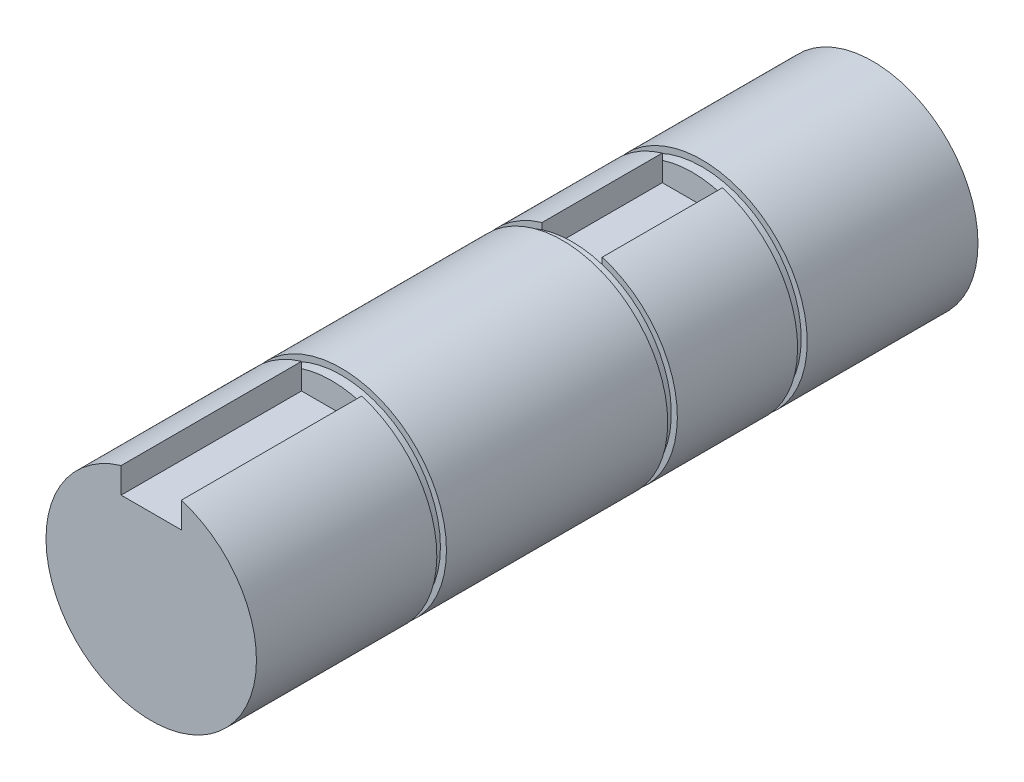
ISO-10303-21;
HEADER;
FILE_DESCRIPTION(('STEP AP214'),'2;1');
FILE_NAME('part.step','',(''),(''),'','','');
FILE_SCHEMA(('AUTOMOTIVE_DESIGN { 1 0 10303 214 1 1 1 1 }'));
ENDSEC;
DATA;
#1=APPLICATION_CONTEXT('core data for automotive mechanical design processes');
#2=APPLICATION_PROTOCOL_DEFINITION('international standard','automotive_design',2000,#1);
#3=PRODUCT_CONTEXT('',#1,'mechanical');
#4=PRODUCT('Part','Part','',(#3));
#5=PRODUCT_RELATED_PRODUCT_CATEGORY('part','',(#4));
#6=PRODUCT_DEFINITION_FORMATION('','',#4);
#7=PRODUCT_DEFINITION_CONTEXT('part definition',#1,'design');
#8=PRODUCT_DEFINITION('design','',#6,#7);
#9=PRODUCT_DEFINITION_SHAPE('','',#8);
#10=(LENGTH_UNIT() NAMED_UNIT(*) SI_UNIT(.MILLI.,.METRE.));
#11=(NAMED_UNIT(*) PLANE_ANGLE_UNIT() SI_UNIT($,.RADIAN.));
#12=(NAMED_UNIT(*) SI_UNIT($,.STERADIAN.) SOLID_ANGLE_UNIT());
#13=UNCERTAINTY_MEASURE_WITH_UNIT(LENGTH_MEASURE(1.E-05),#10,'distance_accuracy_value','');
#14=(GEOMETRIC_REPRESENTATION_CONTEXT(3) GLOBAL_UNCERTAINTY_ASSIGNED_CONTEXT((#13)) GLOBAL_UNIT_ASSIGNED_CONTEXT((#10,
#11,#12)) REPRESENTATION_CONTEXT('',''));
#15=CARTESIAN_POINT('',(0.,0.,0.));
#16=DIRECTION('',(0.,0.,1.));
#17=DIRECTION('',(1.,0.,0.));
#18=AXIS2_PLACEMENT_3D('',#15,#16,#17);
#19=CARTESIAN_POINT('',(0.,0.,120.));
#20=DIRECTION('',(0.,0.,-1.));
#21=DIRECTION('',(-1.,0.,0.));
#22=AXIS2_PLACEMENT_3D('',#19,#20,#21);
#23=CYLINDRICAL_SURFACE('',#22,17.5);
#24=CARTESIAN_POINT('',(0.,0.,28.4));
#25=DIRECTION('',(0.,0.,-1.));
#26=DIRECTION('',(-1.,0.,0.));
#27=AXIS2_PLACEMENT_3D('',#24,#25,#26);
#28=CIRCLE('',#27,17.5);
#29=CARTESIAN_POINT('',(-17.5,0.,28.4));
#30=VERTEX_POINT('',#29);
#31=EDGE_CURVE('E267',#30,#30,#28,.T.);
#32=ORIENTED_EDGE('',*,*,#31,.T.);
#33=EDGE_LOOP('',(#32));
#34=FACE_BOUND('',#33,.T.);
#35=CARTESIAN_POINT('',(0.,0.,0.));
#36=DIRECTION('',(0.,0.,1.));
#37=DIRECTION('',(1.,0.,0.));
#38=AXIS2_PLACEMENT_3D('',#35,#36,#37);
#39=CIRCLE('',#38,17.5);
#40=CARTESIAN_POINT('',(17.5,0.,0.));
#41=VERTEX_POINT('',#40);
#42=EDGE_CURVE('E36',#41,#41,#39,.T.);
#43=ORIENTED_EDGE('',*,*,#42,.T.);
#44=EDGE_LOOP('',(#43));
#45=FACE_BOUND('',#44,.T.);
#46=ADVANCED_FACE('F33',(#34,#45),#23,.T.);
#47=CARTESIAN_POINT('',(0.,0.,0.));
#48=DIRECTION('',(0.,0.,1.));
#49=DIRECTION('',(1.,0.,0.));
#50=AXIS2_PLACEMENT_3D('',#47,#48,#49);
#51=PLANE('',#50);
#52=ORIENTED_EDGE('',*,*,#42,.F.);
#53=EDGE_LOOP('',(#52));
#54=FACE_BOUND('',#53,.T.);
#55=ADVANCED_FACE('F183',(#54),#51,.F.);
#56=CARTESIAN_POINT('',(0.,17.5,30.));
#57=DIRECTION('',(0.,0.,1.));
#58=DIRECTION('',(1.,0.,0.));
#59=AXIS2_PLACEMENT_3D('',#56,#57,#58);
#60=PLANE('',#59);
#61=DIRECTION('',(0.,-1.,0.));
#62=VECTOR('',#61,1.);
#63=CARTESIAN_POINT('',(-5.00000000000001,16.7705098312484,30.));
#64=LINE('',#63,#62);
#65=CARTESIAN_POINT('',(-5.00000000000001,16.7705098312484,30.));
#66=VERTEX_POINT('',#65);
#67=CARTESIAN_POINT('',(-5.00000000000001,15.7241851935164,30.));
#68=VERTEX_POINT('',#67);
#69=EDGE_CURVE('E142',#66,#68,#64,.T.);
#70=ORIENTED_EDGE('',*,*,#69,.T.);
#71=CARTESIAN_POINT('',(0.,0.,30.));
#72=DIRECTION('',(0.,0.,-1.));
#73=DIRECTION('',(-1.,0.,0.));
#74=AXIS2_PLACEMENT_3D('',#71,#72,#73);
#75=CIRCLE('',#74,16.5);
#76=CARTESIAN_POINT('',(4.99999999999999,15.7241851935164,30.));
#77=VERTEX_POINT('',#76);
#78=EDGE_CURVE('E53',#77,#68,#75,.T.);
#79=ORIENTED_EDGE('',*,*,#78,.F.);
#80=DIRECTION('',(0.,1.,0.));
#81=VECTOR('',#80,1.);
#82=CARTESIAN_POINT('',(4.99999999999999,12.5,30.));
#83=LINE('',#82,#81);
#84=CARTESIAN_POINT('',(4.99999999999999,16.7705098312484,30.));
#85=VERTEX_POINT('',#84);
#86=EDGE_CURVE('E161',#77,#85,#83,.T.);
#87=ORIENTED_EDGE('',*,*,#86,.T.);
#88=CARTESIAN_POINT('',(0.,0.,30.));
#89=DIRECTION('',(0.,0.,-1.));
#90=DIRECTION('',(-1.,0.,0.));
#91=AXIS2_PLACEMENT_3D('',#88,#89,#90);
#92=CIRCLE('',#91,17.5);
#93=EDGE_CURVE('E274',#85,#66,#92,.T.);
#94=ORIENTED_EDGE('',*,*,#93,.T.);
#95=EDGE_LOOP('',(#70,#79,#87,#94));
#96=FACE_BOUND('',#95,.T.);
#97=ADVANCED_FACE('F185',(#96),#60,.F.);
#98=CARTESIAN_POINT('',(0.,0.,0.));
#99=DIRECTION('',(0.,0.,-1.));
#100=DIRECTION('',(-1.,0.,0.));
#101=AXIS2_PLACEMENT_3D('',#98,#99,#100);
#102=CYLINDRICAL_SURFACE('',#101,16.5);
#103=CARTESIAN_POINT('',(0.,0.,28.4));
#104=DIRECTION('',(0.,0.,-1.));
#105=DIRECTION('',(-1.,0.,0.));
#106=AXIS2_PLACEMENT_3D('',#103,#104,#105);
#107=CIRCLE('',#106,16.5);
#108=CARTESIAN_POINT('',(-16.5,0.,28.4));
#109=VERTEX_POINT('',#108);
#110=EDGE_CURVE('E270',#109,#109,#107,.T.);
#111=ORIENTED_EDGE('',*,*,#110,.F.);
#112=EDGE_LOOP('',(#111));
#113=FACE_BOUND('',#112,.T.);
#114=EDGE_CURVE('E272',#68,#77,#75,.T.);
#115=ORIENTED_EDGE('',*,*,#114,.T.);
#116=ORIENTED_EDGE('',*,*,#78,.T.);
#117=EDGE_LOOP('',(#115,#116));
#118=FACE_BOUND('',#117,.T.);
#119=ADVANCED_FACE('F190',(#113,#118),#102,.T.);
#120=CARTESIAN_POINT('',(0.,17.5,28.4));
#121=DIRECTION('',(0.,0.,-1.));
#122=DIRECTION('',(-1.,0.,0.));
#123=AXIS2_PLACEMENT_3D('',#120,#121,#122);
#124=PLANE('',#123);
#125=ORIENTED_EDGE('',*,*,#31,.F.);
#126=EDGE_LOOP('',(#125));
#127=FACE_BOUND('',#126,.T.);
#128=ORIENTED_EDGE('',*,*,#110,.T.);
#129=EDGE_LOOP('',(#128));
#130=FACE_BOUND('',#129,.T.);
#131=ADVANCED_FACE('F211',(#127,#130),#124,.F.);
#132=CARTESIAN_POINT('',(-5.00000000000001,12.5,50.));
#133=DIRECTION('',(0.,1.,0.));
#134=DIRECTION('',(0.,0.,1.));
#135=AXIS2_PLACEMENT_3D('',#132,#133,#134);
#136=PLANE('',#135);
#137=DIRECTION('',(1.,0.,0.));
#138=VECTOR('',#137,1.);
#139=CARTESIAN_POINT('',(-5.00000000000001,12.5,30.));
#140=LINE('',#139,#138);
#141=CARTESIAN_POINT('',(-5.00000000000001,12.5,30.));
#142=VERTEX_POINT('',#141);
#143=CARTESIAN_POINT('',(4.99999999999999,12.5,30.));
#144=VERTEX_POINT('',#143);
#145=EDGE_CURVE('E159',#142,#144,#140,.T.);
#146=ORIENTED_EDGE('',*,*,#145,.F.);
#147=DIRECTION('',(0.,0.,-1.));
#148=VECTOR('',#147,1.);
#149=CARTESIAN_POINT('',(-5.00000000000001,12.5,50.));
#150=LINE('',#149,#148);
#151=CARTESIAN_POINT('',(-5.00000000000001,12.5,50.));
#152=VERTEX_POINT('',#151);
#153=EDGE_CURVE('E170',#152,#142,#150,.T.);
#154=ORIENTED_EDGE('',*,*,#153,.F.);
#155=DIRECTION('',(1.,0.,0.));
#156=VECTOR('',#155,1.);
#157=CARTESIAN_POINT('',(-5.00000000000001,12.5,50.));
#158=LINE('',#157,#156);
#159=CARTESIAN_POINT('',(4.99999999999999,12.5,50.));
#160=VERTEX_POINT('',#159);
#161=EDGE_CURVE('E151',#152,#160,#158,.T.);
#162=ORIENTED_EDGE('',*,*,#161,.T.);
#163=DIRECTION('',(0.,0.,-1.));
#164=VECTOR('',#163,1.);
#165=CARTESIAN_POINT('',(4.99999999999999,12.5,50.));
#166=LINE('',#165,#164);
#167=EDGE_CURVE('E167',#160,#144,#166,.T.);
#168=ORIENTED_EDGE('',*,*,#167,.T.);
#169=EDGE_LOOP('',(#146,#154,#162,#168));
#170=FACE_BOUND('',#169,.T.);
#171=ADVANCED_FACE('F207',(#170),#136,.T.);
#172=CARTESIAN_POINT('',(0.,0.,50.));
#173=DIRECTION('',(0.,0.,-1.));
#174=DIRECTION('',(-1.,0.,0.));
#175=AXIS2_PLACEMENT_3D('',#172,#173,#174);
#176=PLANE('',#175);
#177=CARTESIAN_POINT('',(0.,0.,50.));
#178=DIRECTION('',(0.,0.,-1.));
#179=DIRECTION('',(-1.,0.,0.));
#180=AXIS2_PLACEMENT_3D('',#177,#178,#179);
#181=CIRCLE('',#180,16.5);
#182=CARTESIAN_POINT('',(-5.00000000000001,15.7241851935164,50.));
#183=VERTEX_POINT('',#182);
#184=CARTESIAN_POINT('',(4.99999999999999,15.7241851935164,50.));
#185=VERTEX_POINT('',#184);
#186=EDGE_CURVE('E284',#183,#185,#181,.T.);
#187=ORIENTED_EDGE('',*,*,#186,.T.);
#188=DIRECTION('',(0.,1.,0.));
#189=VECTOR('',#188,1.);
#190=CARTESIAN_POINT('',(4.99999999999999,12.5,50.));
#191=LINE('',#190,#189);
#192=EDGE_CURVE('E155',#160,#185,#191,.T.);
#193=ORIENTED_EDGE('',*,*,#192,.F.);
#194=ORIENTED_EDGE('',*,*,#161,.F.);
#195=DIRECTION('',(0.,-1.,0.));
#196=VECTOR('',#195,1.);
#197=CARTESIAN_POINT('',(-5.00000000000001,16.7705098312484,50.));
#198=LINE('',#197,#196);
#199=EDGE_CURVE('E152',#183,#152,#198,.T.);
#200=ORIENTED_EDGE('',*,*,#199,.F.);
#201=EDGE_LOOP('',(#187,#193,#194,#200));
#202=FACE_BOUND('',#201,.T.);
#203=ADVANCED_FACE('F210',(#202),#176,.T.);
#204=CARTESIAN_POINT('',(0.,0.,30.));
#205=DIRECTION('',(0.,0.,-1.));
#206=DIRECTION('',(-1.,0.,0.));
#207=AXIS2_PLACEMENT_3D('',#204,#205,#206);
#208=PLANE('',#207);
#209=EDGE_CURVE('E162',#144,#77,#83,.T.);
#210=ORIENTED_EDGE('',*,*,#209,.T.);
#211=ORIENTED_EDGE('',*,*,#114,.F.);
#212=EDGE_CURVE('E139',#68,#142,#64,.T.);
#213=ORIENTED_EDGE('',*,*,#212,.T.);
#214=ORIENTED_EDGE('',*,*,#145,.T.);
#215=EDGE_LOOP('',(#210,#211,#213,#214));
#216=FACE_BOUND('',#215,.T.);
#217=ADVANCED_FACE('F215',(#216),#208,.F.);
#218=CARTESIAN_POINT('',(4.99999999999999,12.5,50.));
#219=DIRECTION('',(-1.,0.,0.));
#220=DIRECTION('',(0.,0.,1.));
#221=AXIS2_PLACEMENT_3D('',#218,#219,#220);
#222=PLANE('',#221);
#223=ORIENTED_EDGE('',*,*,#209,.F.);
#224=ORIENTED_EDGE('',*,*,#167,.F.);
#225=ORIENTED_EDGE('',*,*,#192,.T.);
#226=CARTESIAN_POINT('',(4.99999999999999,16.7705098312484,50.));
#227=VERTEX_POINT('',#226);
#228=EDGE_CURVE('E154',#185,#227,#191,.T.);
#229=ORIENTED_EDGE('',*,*,#228,.T.);
#230=DIRECTION('',(0.,0.,-1.));
#231=VECTOR('',#230,1.);
#232=CARTESIAN_POINT('',(4.99999999999999,16.7705098312484,50.));
#233=LINE('',#232,#231);
#234=EDGE_CURVE('E157',#227,#85,#233,.T.);
#235=ORIENTED_EDGE('',*,*,#234,.T.);
#236=ORIENTED_EDGE('',*,*,#86,.F.);
#237=EDGE_LOOP('',(#223,#224,#225,#229,#235,#236));
#238=FACE_BOUND('',#237,.T.);
#239=ADVANCED_FACE('F205',(#238),#222,.T.);
#240=CARTESIAN_POINT('',(-5.00000000000001,16.7705098312484,50.));
#241=DIRECTION('',(1.,0.,0.));
#242=DIRECTION('',(0.,0.,-1.));
#243=AXIS2_PLACEMENT_3D('',#240,#241,#242);
#244=PLANE('',#243);
#245=ORIENTED_EDGE('',*,*,#69,.F.);
#246=DIRECTION('',(0.,0.,-1.));
#247=VECTOR('',#246,1.);
#248=CARTESIAN_POINT('',(-5.00000000000001,16.7705098312484,50.));
#249=LINE('',#248,#247);
#250=CARTESIAN_POINT('',(-5.00000000000001,16.7705098312484,50.));
#251=VERTEX_POINT('',#250);
#252=EDGE_CURVE('E173',#251,#66,#249,.T.);
#253=ORIENTED_EDGE('',*,*,#252,.F.);
#254=EDGE_CURVE('E148',#251,#183,#198,.T.);
#255=ORIENTED_EDGE('',*,*,#254,.T.);
#256=ORIENTED_EDGE('',*,*,#199,.T.);
#257=ORIENTED_EDGE('',*,*,#153,.T.);
#258=ORIENTED_EDGE('',*,*,#212,.F.);
#259=EDGE_LOOP('',(#245,#253,#255,#256,#257,#258));
#260=FACE_BOUND('',#259,.T.);
#261=ADVANCED_FACE('F202',(#260),#244,.T.);
#262=ORIENTED_EDGE('',*,*,#252,.T.);
#263=ORIENTED_EDGE('',*,*,#93,.F.);
#264=ORIENTED_EDGE('',*,*,#234,.F.);
#265=CARTESIAN_POINT('',(0.,0.,50.));
#266=DIRECTION('',(0.,0.,-1.));
#267=DIRECTION('',(-1.,0.,0.));
#268=AXIS2_PLACEMENT_3D('',#265,#266,#267);
#269=CIRCLE('',#268,17.5);
#270=EDGE_CURVE('E281',#227,#251,#269,.T.);
#271=ORIENTED_EDGE('',*,*,#270,.T.);
#272=EDGE_LOOP('',(#262,#263,#264,#271));
#273=FACE_BOUND('',#272,.T.);
#274=ADVANCED_FACE('F194',(#273),#23,.T.);
#275=CARTESIAN_POINT('',(0.,17.5,51.6));
#276=DIRECTION('',(0.,0.,1.));
#277=DIRECTION('',(1.,0.,0.));
#278=AXIS2_PLACEMENT_3D('',#275,#276,#277);
#279=PLANE('',#278);
#280=CARTESIAN_POINT('',(0.,0.,51.6));
#281=DIRECTION('',(0.,0.,-1.));
#282=DIRECTION('',(-1.,0.,0.));
#283=AXIS2_PLACEMENT_3D('',#280,#281,#282);
#284=CIRCLE('',#283,16.5);
#285=CARTESIAN_POINT('',(-16.5,0.,51.6));
#286=VERTEX_POINT('',#285);
#287=EDGE_CURVE('E287',#286,#286,#284,.T.);
#288=ORIENTED_EDGE('',*,*,#287,.F.);
#289=EDGE_LOOP('',(#288));
#290=FACE_BOUND('',#289,.T.);
#291=CARTESIAN_POINT('',(0.,0.,51.6));
#292=DIRECTION('',(0.,0.,-1.));
#293=DIRECTION('',(-1.,0.,0.));
#294=AXIS2_PLACEMENT_3D('',#291,#292,#293);
#295=CIRCLE('',#294,17.5);
#296=CARTESIAN_POINT('',(-17.5,0.,51.6));
#297=VERTEX_POINT('',#296);
#298=EDGE_CURVE('E278',#297,#297,#295,.T.);
#299=ORIENTED_EDGE('',*,*,#298,.T.);
#300=EDGE_LOOP('',(#299));
#301=FACE_BOUND('',#300,.T.);
#302=ADVANCED_FACE('F246',(#290,#301),#279,.F.);
#303=CARTESIAN_POINT('',(0.,0.,0.));
#304=DIRECTION('',(0.,0.,-1.));
#305=DIRECTION('',(-1.,0.,0.));
#306=AXIS2_PLACEMENT_3D('',#303,#304,#305);
#307=CYLINDRICAL_SURFACE('',#306,16.5);
#308=ORIENTED_EDGE('',*,*,#186,.F.);
#309=EDGE_CURVE('E46',#185,#183,#181,.T.);
#310=ORIENTED_EDGE('',*,*,#309,.F.);
#311=EDGE_LOOP('',(#308,#310));
#312=FACE_BOUND('',#311,.T.);
#313=ORIENTED_EDGE('',*,*,#287,.T.);
#314=EDGE_LOOP('',(#313));
#315=FACE_BOUND('',#314,.T.);
#316=ADVANCED_FACE('F249',(#312,#315),#307,.T.);
#317=CARTESIAN_POINT('',(0.,17.5,50.));
#318=DIRECTION('',(0.,0.,-1.));
#319=DIRECTION('',(-1.,0.,0.));
#320=AXIS2_PLACEMENT_3D('',#317,#318,#319);
#321=PLANE('',#320);
#322=ORIENTED_EDGE('',*,*,#254,.F.);
#323=ORIENTED_EDGE('',*,*,#270,.F.);
#324=ORIENTED_EDGE('',*,*,#228,.F.);
#325=ORIENTED_EDGE('',*,*,#309,.T.);
#326=EDGE_LOOP('',(#322,#323,#324,#325));
#327=FACE_BOUND('',#326,.T.);
#328=ADVANCED_FACE('F253',(#327),#321,.F.);
#329=ORIENTED_EDGE('',*,*,#298,.F.);
#330=EDGE_LOOP('',(#329));
#331=FACE_BOUND('',#330,.T.);
#332=CARTESIAN_POINT('',(0.,0.,88.4));
#333=DIRECTION('',(0.,0.,-1.));
#334=DIRECTION('',(-1.,0.,0.));
#335=AXIS2_PLACEMENT_3D('',#332,#333,#334);
#336=CIRCLE('',#335,17.5);
#337=CARTESIAN_POINT('',(-17.5,0.,88.4));
#338=VERTEX_POINT('',#337);
#339=EDGE_CURVE('E126',#338,#338,#336,.T.);
#340=ORIENTED_EDGE('',*,*,#339,.T.);
#341=EDGE_LOOP('',(#340));
#342=FACE_BOUND('',#341,.T.);
#343=ADVANCED_FACE('F239',(#331,#342),#23,.T.);
#344=CARTESIAN_POINT('',(0.,17.5,90.));
#345=DIRECTION('',(0.,0.,1.));
#346=DIRECTION('',(1.,0.,0.));
#347=AXIS2_PLACEMENT_3D('',#344,#345,#346);
#348=PLANE('',#347);
#349=DIRECTION('',(0.,-1.,0.));
#350=VECTOR('',#349,1.);
#351=CARTESIAN_POINT('',(-5.00000000000001,16.7705098312484,90.));
#352=LINE('',#351,#350);
#353=CARTESIAN_POINT('',(-5.00000000000001,16.7705098312484,90.));
#354=VERTEX_POINT('',#353);
#355=CARTESIAN_POINT('',(-5.00000000000001,15.7241851935164,90.));
#356=VERTEX_POINT('',#355);
#357=EDGE_CURVE('E118',#354,#356,#352,.T.);
#358=ORIENTED_EDGE('',*,*,#357,.T.);
#359=CARTESIAN_POINT('',(0.,0.,90.));
#360=DIRECTION('',(0.,0.,-1.));
#361=DIRECTION('',(-1.,0.,0.));
#362=AXIS2_PLACEMENT_3D('',#359,#360,#361);
#363=CIRCLE('',#362,16.5);
#364=CARTESIAN_POINT('',(4.99999999999999,15.7241851935164,90.));
#365=VERTEX_POINT('',#364);
#366=EDGE_CURVE('E295',#365,#356,#363,.T.);
#367=ORIENTED_EDGE('',*,*,#366,.F.);
#368=DIRECTION('',(0.,1.,0.));
#369=VECTOR('',#368,1.);
#370=CARTESIAN_POINT('',(4.99999999999999,12.5,90.));
#371=LINE('',#370,#369);
#372=CARTESIAN_POINT('',(4.99999999999999,16.7705098312484,90.));
#373=VERTEX_POINT('',#372);
#374=EDGE_CURVE('E121',#365,#373,#371,.T.);
#375=ORIENTED_EDGE('',*,*,#374,.T.);
#376=CARTESIAN_POINT('',(0.,0.,90.));
#377=DIRECTION('',(0.,0.,-1.));
#378=DIRECTION('',(-1.,0.,0.));
#379=AXIS2_PLACEMENT_3D('',#376,#377,#378);
#380=CIRCLE('',#379,17.5);
#381=EDGE_CURVE('E115',#373,#354,#380,.T.);
#382=ORIENTED_EDGE('',*,*,#381,.T.);
#383=EDGE_LOOP('',(#358,#367,#375,#382));
#384=FACE_BOUND('',#383,.T.);
#385=ADVANCED_FACE('F117',(#384),#348,.F.);
#386=CARTESIAN_POINT('',(0.,0.,0.));
#387=DIRECTION('',(0.,0.,-1.));
#388=DIRECTION('',(-1.,0.,0.));
#389=AXIS2_PLACEMENT_3D('',#386,#387,#388);
#390=CYLINDRICAL_SURFACE('',#389,16.5);
#391=CARTESIAN_POINT('',(0.,0.,88.4));
#392=DIRECTION('',(0.,0.,-1.));
#393=DIRECTION('',(-1.,0.,0.));
#394=AXIS2_PLACEMENT_3D('',#391,#392,#393);
#395=CIRCLE('',#394,16.5);
#396=CARTESIAN_POINT('',(-16.5,0.,88.4));
#397=VERTEX_POINT('',#396);
#398=EDGE_CURVE('E292',#397,#397,#395,.T.);
#399=ORIENTED_EDGE('',*,*,#398,.F.);
#400=EDGE_LOOP('',(#399));
#401=FACE_BOUND('',#400,.T.);
#402=EDGE_CURVE('E282',#356,#365,#363,.T.);
#403=ORIENTED_EDGE('',*,*,#402,.T.);
#404=ORIENTED_EDGE('',*,*,#366,.T.);
#405=EDGE_LOOP('',(#403,#404));
#406=FACE_BOUND('',#405,.T.);
#407=ADVANCED_FACE('F238',(#401,#406),#390,.T.);
#408=CARTESIAN_POINT('',(0.,17.5,88.4));
#409=DIRECTION('',(0.,0.,-1.));
#410=DIRECTION('',(-1.,0.,0.));
#411=AXIS2_PLACEMENT_3D('',#408,#409,#410);
#412=PLANE('',#411);
#413=ORIENTED_EDGE('',*,*,#339,.F.);
#414=EDGE_LOOP('',(#413));
#415=FACE_BOUND('',#414,.T.);
#416=ORIENTED_EDGE('',*,*,#398,.T.);
#417=EDGE_LOOP('',(#416));
#418=FACE_BOUND('',#417,.T.);
#419=ADVANCED_FACE('F200',(#415,#418),#412,.F.);
#420=CARTESIAN_POINT('',(0.,0.,120.));
#421=DIRECTION('',(0.,0.,1.));
#422=DIRECTION('',(1.,0.,0.));
#423=AXIS2_PLACEMENT_3D('',#420,#421,#422);
#424=PLANE('',#423);
#425=DIRECTION('',(1.,0.,0.));
#426=VECTOR('',#425,1.);
#427=CARTESIAN_POINT('',(-5.00000000000001,12.5,120.));
#428=LINE('',#427,#426);
#429=CARTESIAN_POINT('',(-5.00000000000001,12.5,120.));
#430=VERTEX_POINT('',#429);
#431=CARTESIAN_POINT('',(4.99999999999999,12.5,120.));
#432=VERTEX_POINT('',#431);
#433=EDGE_CURVE('E300',#430,#432,#428,.T.);
#434=ORIENTED_EDGE('',*,*,#433,.F.);
#435=DIRECTION('',(0.,-1.,0.));
#436=VECTOR('',#435,1.);
#437=CARTESIAN_POINT('',(-5.00000000000001,16.7705098312484,120.));
#438=LINE('',#437,#436);
#439=CARTESIAN_POINT('',(-5.00000000000001,16.7705098312484,120.));
#440=VERTEX_POINT('',#439);
#441=EDGE_CURVE('E298',#440,#430,#438,.T.);
#442=ORIENTED_EDGE('',*,*,#441,.F.);
#443=CARTESIAN_POINT('',(0.,0.,120.));
#444=DIRECTION('',(0.,0.,1.));
#445=DIRECTION('',(1.,0.,0.));
#446=AXIS2_PLACEMENT_3D('',#443,#444,#445);
#447=CIRCLE('',#446,17.5);
#448=CARTESIAN_POINT('',(4.99999999999999,16.7705098312484,120.));
#449=VERTEX_POINT('',#448);
#450=EDGE_CURVE('E11',#440,#449,#447,.T.);
#451=ORIENTED_EDGE('',*,*,#450,.T.);
#452=DIRECTION('',(0.,1.,0.));
#453=VECTOR('',#452,1.);
#454=CARTESIAN_POINT('',(4.99999999999999,12.5,120.));
#455=LINE('',#454,#453);
#456=EDGE_CURVE('E304',#432,#449,#455,.T.);
#457=ORIENTED_EDGE('',*,*,#456,.F.);
#458=EDGE_LOOP('',(#434,#442,#451,#457));
#459=FACE_BOUND('',#458,.T.);
#460=ADVANCED_FACE('F196',(#459),#424,.T.);
#461=CARTESIAN_POINT('',(-5.00000000000001,12.5,120.));
#462=DIRECTION('',(0.,1.,0.));
#463=DIRECTION('',(0.,0.,1.));
#464=AXIS2_PLACEMENT_3D('',#461,#462,#463);
#465=PLANE('',#464);
#466=DIRECTION('',(1.,0.,0.));
#467=VECTOR('',#466,1.);
#468=CARTESIAN_POINT('',(-5.00000000000001,12.5,90.));
#469=LINE('',#468,#467);
#470=CARTESIAN_POINT('',(-5.00000000000001,12.5,90.));
#471=VERTEX_POINT('',#470);
#472=CARTESIAN_POINT('',(4.99999999999999,12.5,90.));
#473=VERTEX_POINT('',#472);
#474=EDGE_CURVE('E135',#471,#473,#469,.T.);
#475=ORIENTED_EDGE('',*,*,#474,.F.);
#476=DIRECTION('',(0.,0.,-1.));
#477=VECTOR('',#476,1.);
#478=CARTESIAN_POINT('',(-5.00000000000001,12.5,120.));
#479=LINE('',#478,#477);
#480=EDGE_CURVE('E140',#430,#471,#479,.T.);
#481=ORIENTED_EDGE('',*,*,#480,.F.);
#482=ORIENTED_EDGE('',*,*,#433,.T.);
#483=DIRECTION('',(0.,0.,-1.));
#484=VECTOR('',#483,1.);
#485=CARTESIAN_POINT('',(4.99999999999999,12.5,120.));
#486=LINE('',#485,#484);
#487=EDGE_CURVE('E144',#432,#473,#486,.T.);
#488=ORIENTED_EDGE('',*,*,#487,.T.);
#489=EDGE_LOOP('',(#475,#481,#482,#488));
#490=FACE_BOUND('',#489,.T.);
#491=ADVANCED_FACE('F199',(#490),#465,.T.);
#492=CARTESIAN_POINT('',(0.,0.,90.));
#493=DIRECTION('',(0.,0.,-1.));
#494=DIRECTION('',(-1.,0.,0.));
#495=AXIS2_PLACEMENT_3D('',#492,#493,#494);
#496=PLANE('',#495);
#497=EDGE_CURVE('E301',#473,#365,#371,.T.);
#498=ORIENTED_EDGE('',*,*,#497,.T.);
#499=ORIENTED_EDGE('',*,*,#402,.F.);
#500=EDGE_CURVE('E134',#356,#471,#352,.T.);
#501=ORIENTED_EDGE('',*,*,#500,.T.);
#502=ORIENTED_EDGE('',*,*,#474,.T.);
#503=EDGE_LOOP('',(#498,#499,#501,#502));
#504=FACE_BOUND('',#503,.T.);
#505=ADVANCED_FACE('F228',(#504),#496,.F.);
#506=CARTESIAN_POINT('',(4.99999999999999,12.5,120.));
#507=DIRECTION('',(-1.,0.,0.));
#508=DIRECTION('',(0.,0.,1.));
#509=AXIS2_PLACEMENT_3D('',#506,#507,#508);
#510=PLANE('',#509);
#511=ORIENTED_EDGE('',*,*,#497,.F.);
#512=ORIENTED_EDGE('',*,*,#487,.F.);
#513=ORIENTED_EDGE('',*,*,#456,.T.);
#514=DIRECTION('',(0.,0.,-1.));
#515=VECTOR('',#514,1.);
#516=CARTESIAN_POINT('',(4.99999999999999,16.7705098312484,120.));
#517=LINE('',#516,#515);
#518=EDGE_CURVE('E305',#449,#373,#517,.T.);
#519=ORIENTED_EDGE('',*,*,#518,.T.);
#520=ORIENTED_EDGE('',*,*,#374,.F.);
#521=EDGE_LOOP('',(#511,#512,#513,#519,#520));
#522=FACE_BOUND('',#521,.T.);
#523=ADVANCED_FACE('F225',(#522),#510,.T.);
#524=CARTESIAN_POINT('',(-5.00000000000001,16.7705098312484,120.));
#525=DIRECTION('',(1.,0.,0.));
#526=DIRECTION('',(0.,0.,-1.));
#527=AXIS2_PLACEMENT_3D('',#524,#525,#526);
#528=PLANE('',#527);
#529=ORIENTED_EDGE('',*,*,#357,.F.);
#530=DIRECTION('',(0.,0.,-1.));
#531=VECTOR('',#530,1.);
#532=CARTESIAN_POINT('',(-5.00000000000001,16.7705098312484,120.));
#533=LINE('',#532,#531);
#534=EDGE_CURVE('E131',#440,#354,#533,.T.);
#535=ORIENTED_EDGE('',*,*,#534,.F.);
#536=ORIENTED_EDGE('',*,*,#441,.T.);
#537=ORIENTED_EDGE('',*,*,#480,.T.);
#538=ORIENTED_EDGE('',*,*,#500,.F.);
#539=EDGE_LOOP('',(#529,#535,#536,#537,#538));
#540=FACE_BOUND('',#539,.T.);
#541=ADVANCED_FACE('F130',(#540),#528,.T.);
#542=ORIENTED_EDGE('',*,*,#534,.T.);
#543=ORIENTED_EDGE('',*,*,#381,.F.);
#544=ORIENTED_EDGE('',*,*,#518,.F.);
#545=ORIENTED_EDGE('',*,*,#450,.F.);
#546=EDGE_LOOP('',(#542,#543,#544,#545));
#547=FACE_BOUND('',#546,.T.);
#548=ADVANCED_FACE('F138',(#547),#23,.T.);
#549=CLOSED_SHELL('',(#46,#55,#97,#119,#131,#171,#203,#217,#239,#261,#274,#302,#316,#328,#343,
#385,#407,#419,#460,#491,#505,#523,#541,#548));
#550=MANIFOLD_SOLID_BREP('B2',#549);
#551=ADVANCED_BREP_SHAPE_REPRESENTATION('',(#18,#550),#14);
#552=SHAPE_DEFINITION_REPRESENTATION(#9,#551);
ENDSEC;
END-ISO-10303-21;
